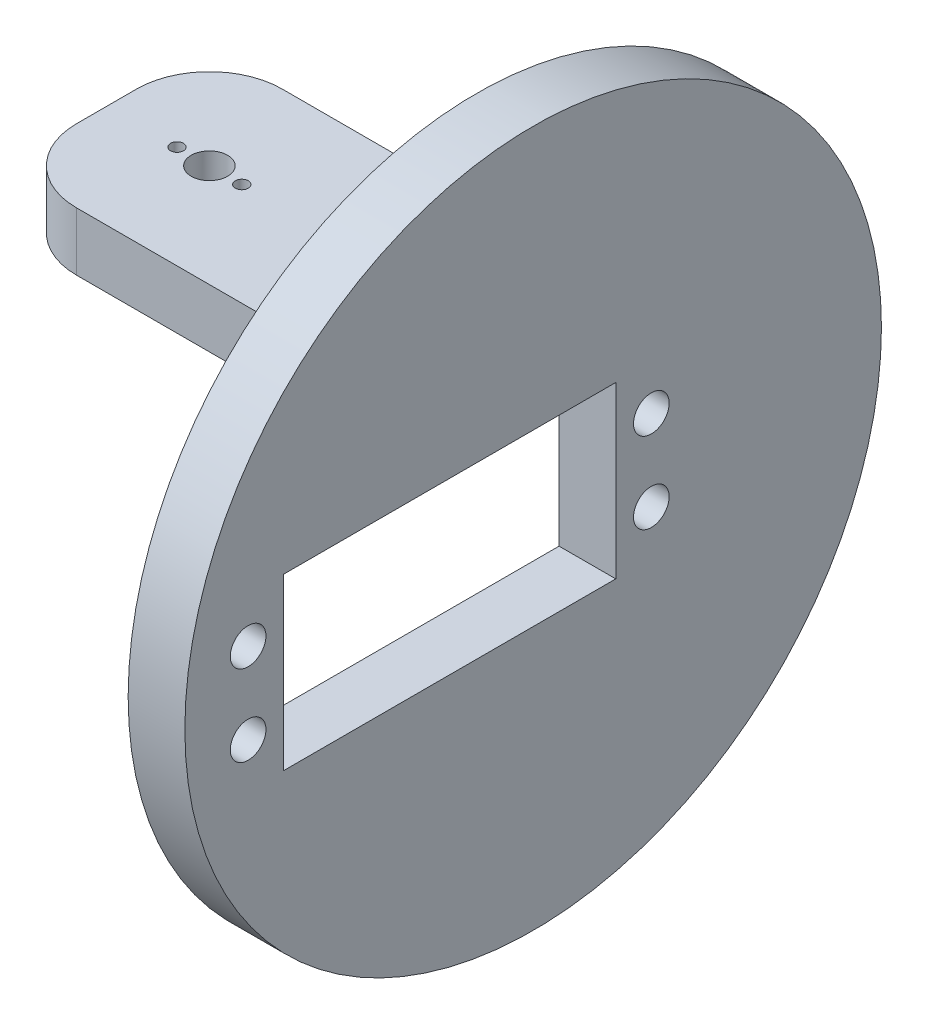
ISO-10303-21;
HEADER;
FILE_DESCRIPTION(('STEP AP214'),'2;1');
FILE_NAME('part.step','',(''),(''),'','','');
FILE_SCHEMA(('AUTOMOTIVE_DESIGN { 1 0 10303 214 1 1 1 1 }'));
ENDSEC;
DATA;
#1=APPLICATION_CONTEXT('core data for automotive mechanical design processes');
#2=APPLICATION_PROTOCOL_DEFINITION('international standard','automotive_design',2000,#1);
#3=PRODUCT_CONTEXT('',#1,'mechanical');
#4=PRODUCT('Part','Part','',(#3));
#5=PRODUCT_RELATED_PRODUCT_CATEGORY('part','',(#4));
#6=PRODUCT_DEFINITION_FORMATION('','',#4);
#7=PRODUCT_DEFINITION_CONTEXT('part definition',#1,'design');
#8=PRODUCT_DEFINITION('design','',#6,#7);
#9=PRODUCT_DEFINITION_SHAPE('','',#8);
#10=(LENGTH_UNIT() NAMED_UNIT(*) SI_UNIT(.MILLI.,.METRE.));
#11=(NAMED_UNIT(*) PLANE_ANGLE_UNIT() SI_UNIT($,.RADIAN.));
#12=(NAMED_UNIT(*) SI_UNIT($,.STERADIAN.) SOLID_ANGLE_UNIT());
#13=UNCERTAINTY_MEASURE_WITH_UNIT(LENGTH_MEASURE(1.E-05),#10,'distance_accuracy_value','');
#14=(GEOMETRIC_REPRESENTATION_CONTEXT(3) GLOBAL_UNCERTAINTY_ASSIGNED_CONTEXT((#13)) GLOBAL_UNIT_ASSIGNED_CONTEXT((#10,
#11,#12)) REPRESENTATION_CONTEXT('',''));
#15=CARTESIAN_POINT('',(0.,0.,0.));
#16=DIRECTION('',(0.,0.,1.));
#17=DIRECTION('',(1.,0.,0.));
#18=AXIS2_PLACEMENT_3D('',#15,#16,#17);
#19=CARTESIAN_POINT('',(-15.1051071083568,0.,0.66801642900486));
#20=DIRECTION('',(0.,1.,0.));
#21=DIRECTION('',(0.,0.,1.));
#22=AXIS2_PLACEMENT_3D('',#19,#20,#21);
#23=CYLINDRICAL_SURFACE('',#22,2.25);
#24=CARTESIAN_POINT('',(-15.1051071083568,7.2,0.66801642900486));
#25=DIRECTION('',(0.,1.,0.));
#26=DIRECTION('',(0.,0.,1.));
#27=AXIS2_PLACEMENT_3D('',#24,#25,#26);
#28=CIRCLE('',#27,2.25);
#29=CARTESIAN_POINT('',(-15.1051071083568,7.2,2.91801642900486));
#30=VERTEX_POINT('',#29);
#31=EDGE_CURVE('E239',#30,#30,#28,.T.);
#32=ORIENTED_EDGE('',*,*,#31,.T.);
#33=EDGE_LOOP('',(#32));
#34=FACE_BOUND('',#33,.T.);
#35=CARTESIAN_POINT('',(-15.1051071083568,4.,0.66801642900486));
#36=DIRECTION('',(0.,-1.,0.));
#37=DIRECTION('',(0.,0.,-1.));
#38=AXIS2_PLACEMENT_3D('',#35,#36,#37);
#39=CIRCLE('',#38,2.25);
#40=CARTESIAN_POINT('',(-15.1051071083568,4.,-1.58198357099514));
#41=VERTEX_POINT('',#40);
#42=EDGE_CURVE('E232',#41,#41,#39,.F.);
#43=ORIENTED_EDGE('',*,*,#42,.F.);
#44=EDGE_LOOP('',(#43));
#45=FACE_BOUND('',#44,.T.);
#46=ADVANCED_FACE('F32',(#34,#45),#23,.F.);
#47=CARTESIAN_POINT('',(-19.1051071083568,0.,0.66801642900486));
#48=DIRECTION('',(0.,1.,0.));
#49=DIRECTION('',(0.,0.,1.));
#50=AXIS2_PLACEMENT_3D('',#47,#48,#49);
#51=CYLINDRICAL_SURFACE('',#50,0.799999999999999);
#52=CARTESIAN_POINT('',(-19.1051071083568,7.2,0.66801642900486));
#53=DIRECTION('',(0.,1.,0.));
#54=DIRECTION('',(0.,0.,1.));
#55=AXIS2_PLACEMENT_3D('',#52,#53,#54);
#56=CIRCLE('',#55,0.799999999999999);
#57=CARTESIAN_POINT('',(-19.1051071083568,7.2,1.46801642900486));
#58=VERTEX_POINT('',#57);
#59=EDGE_CURVE('E236',#58,#58,#56,.T.);
#60=ORIENTED_EDGE('',*,*,#59,.T.);
#61=EDGE_LOOP('',(#60));
#62=FACE_BOUND('',#61,.T.);
#63=CARTESIAN_POINT('',(-19.1051071083568,4.,0.66801642900486));
#64=DIRECTION('',(0.,-1.,0.));
#65=DIRECTION('',(0.,0.,-1.));
#66=AXIS2_PLACEMENT_3D('',#63,#64,#65);
#67=CIRCLE('',#66,0.799999999999999);
#68=CARTESIAN_POINT('',(-19.1051071083568,4.,-0.131983570995139));
#69=VERTEX_POINT('',#68);
#70=EDGE_CURVE('E229',#69,#69,#67,.F.);
#71=ORIENTED_EDGE('',*,*,#70,.F.);
#72=EDGE_LOOP('',(#71));
#73=FACE_BOUND('',#72,.T.);
#74=ADVANCED_FACE('F335',(#62,#73),#51,.F.);
#75=CARTESIAN_POINT('',(-11.1051071083568,0.,0.66801642900486));
#76=DIRECTION('',(0.,1.,0.));
#77=DIRECTION('',(0.,0.,1.));
#78=AXIS2_PLACEMENT_3D('',#75,#76,#77);
#79=CYLINDRICAL_SURFACE('',#78,0.800000000000001);
#80=CARTESIAN_POINT('',(-11.1051071083568,7.2,0.66801642900486));
#81=DIRECTION('',(0.,1.,0.));
#82=DIRECTION('',(0.,0.,1.));
#83=AXIS2_PLACEMENT_3D('',#80,#81,#82);
#84=CIRCLE('',#83,0.800000000000001);
#85=CARTESIAN_POINT('',(-11.1051071083568,7.2,1.46801642900486));
#86=VERTEX_POINT('',#85);
#87=EDGE_CURVE('E235',#86,#86,#84,.T.);
#88=ORIENTED_EDGE('',*,*,#87,.T.);
#89=EDGE_LOOP('',(#88));
#90=FACE_BOUND('',#89,.T.);
#91=CARTESIAN_POINT('',(-11.1051071083568,4.,0.66801642900486));
#92=DIRECTION('',(0.,-1.,0.));
#93=DIRECTION('',(0.,0.,-1.));
#94=AXIS2_PLACEMENT_3D('',#91,#92,#93);
#95=CIRCLE('',#94,0.800000000000001);
#96=CARTESIAN_POINT('',(-11.1051071083568,4.,-0.131983570995141));
#97=VERTEX_POINT('',#96);
#98=EDGE_CURVE('E36',#97,#97,#95,.F.);
#99=ORIENTED_EDGE('',*,*,#98,.F.);
#100=EDGE_LOOP('',(#99));
#101=FACE_BOUND('',#100,.T.);
#102=ADVANCED_FACE('F341',(#90,#101),#79,.F.);
#103=CARTESIAN_POINT('',(-27.8051071083568,7.2,-12.0319835709951));
#104=DIRECTION('',(1.,0.,0.));
#105=DIRECTION('',(0.,0.,-1.));
#106=AXIS2_PLACEMENT_3D('',#103,#104,#105);
#107=PLANE('',#106);
#108=DIRECTION('',(0.,0.,1.));
#109=VECTOR('',#108,1.);
#110=CARTESIAN_POINT('',(-27.8051071083568,0.,-12.0319835709951));
#111=LINE('',#110,#109);
#112=CARTESIAN_POINT('',(-27.8051071083568,0.,-3.03198357099514));
#113=VERTEX_POINT('',#112);
#114=CARTESIAN_POINT('',(-27.8051071083568,0.,4.36801642900486));
#115=VERTEX_POINT('',#114);
#116=EDGE_CURVE('E244',#113,#115,#111,.T.);
#117=ORIENTED_EDGE('',*,*,#116,.T.);
#118=DIRECTION('',(0.,-1.,0.));
#119=VECTOR('',#118,1.);
#120=CARTESIAN_POINT('',(-27.8051071083568,7.2,4.36801642900486));
#121=LINE('',#120,#119);
#122=CARTESIAN_POINT('',(-27.8051071083568,7.2,4.36801642900486));
#123=VERTEX_POINT('',#122);
#124=EDGE_CURVE('E281',#115,#123,#121,.F.);
#125=ORIENTED_EDGE('',*,*,#124,.T.);
#126=DIRECTION('',(0.,0.,1.));
#127=VECTOR('',#126,1.);
#128=CARTESIAN_POINT('',(-27.8051071083568,7.2,-12.0319835709951));
#129=LINE('',#128,#127);
#130=CARTESIAN_POINT('',(-27.8051071083568,7.2,-3.03198357099514));
#131=VERTEX_POINT('',#130);
#132=EDGE_CURVE('E245',#131,#123,#129,.T.);
#133=ORIENTED_EDGE('',*,*,#132,.F.);
#134=DIRECTION('',(0.,-1.,0.));
#135=VECTOR('',#134,1.);
#136=CARTESIAN_POINT('',(-27.8051071083568,7.2,-3.03198357099514));
#137=LINE('',#136,#135);
#138=EDGE_CURVE('E278',#131,#113,#137,.T.);
#139=ORIENTED_EDGE('',*,*,#138,.T.);
#140=EDGE_LOOP('',(#117,#125,#133,#139));
#141=FACE_BOUND('',#140,.T.);
#142=ADVANCED_FACE('F303',(#141),#107,.F.);
#143=CARTESIAN_POINT('',(-27.8051071083568,7.2,13.3680164290049));
#144=DIRECTION('',(0.,0.,-1.));
#145=DIRECTION('',(-1.,0.,0.));
#146=AXIS2_PLACEMENT_3D('',#143,#144,#145);
#147=PLANE('',#146);
#148=DIRECTION('',(1.,0.,0.));
#149=VECTOR('',#148,1.);
#150=CARTESIAN_POINT('',(-27.8051071083568,7.2,13.3680164290049));
#151=LINE('',#150,#149);
#152=CARTESIAN_POINT('',(-18.8051071083568,7.2,13.3680164290049));
#153=VERTEX_POINT('',#152);
#154=CARTESIAN_POINT('',(17.1948928916432,7.2,13.3680164290049));
#155=VERTEX_POINT('',#154);
#156=EDGE_CURVE('E248',#153,#155,#151,.T.);
#157=ORIENTED_EDGE('',*,*,#156,.F.);
#158=DIRECTION('',(0.,-1.,0.));
#159=VECTOR('',#158,1.);
#160=CARTESIAN_POINT('',(-18.8051071083568,7.2,13.3680164290049));
#161=LINE('',#160,#159);
#162=CARTESIAN_POINT('',(-18.8051071083568,0.,13.3680164290049));
#163=VERTEX_POINT('',#162);
#164=EDGE_CURVE('E271',#153,#163,#161,.T.);
#165=ORIENTED_EDGE('',*,*,#164,.T.);
#166=DIRECTION('',(1.,0.,0.));
#167=VECTOR('',#166,1.);
#168=CARTESIAN_POINT('',(-27.8051071083568,0.,13.3680164290049));
#169=LINE('',#168,#167);
#170=CARTESIAN_POINT('',(17.1948928916432,0.,13.3680164290049));
#171=VERTEX_POINT('',#170);
#172=EDGE_CURVE('E259',#163,#171,#169,.T.);
#173=ORIENTED_EDGE('',*,*,#172,.T.);
#174=DIRECTION('',(0.,-1.,0.));
#175=VECTOR('',#174,1.);
#176=CARTESIAN_POINT('',(17.1948928916432,7.2,13.3680164290049));
#177=LINE('',#176,#175);
#178=EDGE_CURVE('E268',#155,#171,#177,.T.);
#179=ORIENTED_EDGE('',*,*,#178,.F.);
#180=EDGE_LOOP('',(#157,#165,#173,#179));
#181=FACE_BOUND('',#180,.T.);
#182=ADVANCED_FACE('F295',(#181),#147,.F.);
#183=CARTESIAN_POINT('',(-27.8051071083568,7.2,-12.0319835709951));
#184=DIRECTION('',(0.,0.,1.));
#185=DIRECTION('',(1.,0.,0.));
#186=AXIS2_PLACEMENT_3D('',#183,#184,#185);
#187=PLANE('',#186);
#188=DIRECTION('',(-1.,0.,0.));
#189=VECTOR('',#188,1.);
#190=CARTESIAN_POINT('',(-27.8051071083568,0.,-12.0319835709951));
#191=LINE('',#190,#189);
#192=CARTESIAN_POINT('',(17.1948928916432,0.,-12.0319835709951));
#193=VERTEX_POINT('',#192);
#194=CARTESIAN_POINT('',(-18.8051071083568,0.,-12.0319835709951));
#195=VERTEX_POINT('',#194);
#196=EDGE_CURVE('E249',#193,#195,#191,.T.);
#197=ORIENTED_EDGE('',*,*,#196,.T.);
#198=DIRECTION('',(0.,-1.,0.));
#199=VECTOR('',#198,1.);
#200=CARTESIAN_POINT('',(-18.8051071083568,7.2,-12.0319835709951));
#201=LINE('',#200,#199);
#202=CARTESIAN_POINT('',(-18.8051071083568,7.2,-12.0319835709951));
#203=VERTEX_POINT('',#202);
#204=EDGE_CURVE('E11',#195,#203,#201,.F.);
#205=ORIENTED_EDGE('',*,*,#204,.T.);
#206=DIRECTION('',(-1.,0.,0.));
#207=VECTOR('',#206,1.);
#208=CARTESIAN_POINT('',(-27.8051071083568,7.2,-12.0319835709951));
#209=LINE('',#208,#207);
#210=CARTESIAN_POINT('',(17.1948928916432,7.2,-12.0319835709951));
#211=VERTEX_POINT('',#210);
#212=EDGE_CURVE('E253',#211,#203,#209,.T.);
#213=ORIENTED_EDGE('',*,*,#212,.F.);
#214=DIRECTION('',(0.,-1.,0.));
#215=VECTOR('',#214,1.);
#216=CARTESIAN_POINT('',(17.1948928916432,7.2,-12.0319835709951));
#217=LINE('',#216,#215);
#218=EDGE_CURVE('E256',#211,#193,#217,.T.);
#219=ORIENTED_EDGE('',*,*,#218,.T.);
#220=EDGE_LOOP('',(#197,#205,#213,#219));
#221=FACE_BOUND('',#220,.T.);
#222=ADVANCED_FACE('F310',(#221),#187,.F.);
#223=CARTESIAN_POINT('',(0.,7.2,0.));
#224=DIRECTION('',(0.,1.,0.));
#225=DIRECTION('',(0.,0.,1.));
#226=AXIS2_PLACEMENT_3D('',#223,#224,#225);
#227=PLANE('',#226);
#228=ORIENTED_EDGE('',*,*,#87,.F.);
#229=EDGE_LOOP('',(#228));
#230=FACE_BOUND('',#229,.T.);
#231=ORIENTED_EDGE('',*,*,#59,.F.);
#232=EDGE_LOOP('',(#231));
#233=FACE_BOUND('',#232,.T.);
#234=ORIENTED_EDGE('',*,*,#31,.F.);
#235=EDGE_LOOP('',(#234));
#236=FACE_BOUND('',#235,.T.);
#237=ORIENTED_EDGE('',*,*,#132,.T.);
#238=CARTESIAN_POINT('',(-18.8051071083568,7.2,4.36801642900486));
#239=DIRECTION('',(0.,1.,0.));
#240=DIRECTION('',(0.,0.,1.));
#241=AXIS2_PLACEMENT_3D('',#238,#239,#240);
#242=CIRCLE('',#241,9.);
#243=EDGE_CURVE('E41',#123,#153,#242,.T.);
#244=ORIENTED_EDGE('',*,*,#243,.T.);
#245=ORIENTED_EDGE('',*,*,#156,.T.);
#246=DIRECTION('',(0.,0.,-1.));
#247=VECTOR('',#246,1.);
#248=CARTESIAN_POINT('',(17.1948928916432,7.2,-12.0319835709951));
#249=LINE('',#248,#247);
#250=EDGE_CURVE('E251',#155,#211,#249,.T.);
#251=ORIENTED_EDGE('',*,*,#250,.T.);
#252=ORIENTED_EDGE('',*,*,#212,.T.);
#253=CARTESIAN_POINT('',(-18.8051071083568,7.2,-3.03198357099514));
#254=DIRECTION('',(0.,1.,0.));
#255=DIRECTION('',(0.,0.,1.));
#256=AXIS2_PLACEMENT_3D('',#253,#254,#255);
#257=CIRCLE('',#256,9.);
#258=EDGE_CURVE('E283',#203,#131,#257,.T.);
#259=ORIENTED_EDGE('',*,*,#258,.T.);
#260=EDGE_LOOP('',(#237,#244,#245,#251,#252,#259));
#261=FACE_BOUND('',#260,.T.);
#262=ADVANCED_FACE('F288',(#230,#233,#236,#261),#227,.T.);
#263=CARTESIAN_POINT('',(0.,0.,0.));
#264=DIRECTION('',(0.,1.,0.));
#265=DIRECTION('',(0.,0.,1.));
#266=AXIS2_PLACEMENT_3D('',#263,#264,#265);
#267=PLANE('',#266);
#268=DIRECTION('',(1.,0.,0.));
#269=VECTOR('',#268,1.);
#270=CARTESIAN_POINT('',(-19.1051071083568,0.,-2.4822661461066));
#271=LINE('',#270,#269);
#272=CARTESIAN_POINT('',(-19.1051071083568,0.,-2.4822661461066));
#273=VERTEX_POINT('',#272);
#274=CARTESIAN_POINT('',(-11.1051071083567,0.,-2.4822661461066));
#275=VERTEX_POINT('',#274);
#276=EDGE_CURVE('E213',#273,#275,#271,.T.);
#277=ORIENTED_EDGE('',*,*,#276,.F.);
#278=CARTESIAN_POINT('',(-19.1051071083568,0.,0.66801642900486));
#279=DIRECTION('',(0.,-1.,0.));
#280=DIRECTION('',(0.,0.,-1.));
#281=AXIS2_PLACEMENT_3D('',#278,#279,#280);
#282=CIRCLE('',#281,3.15028257511146);
#283=CARTESIAN_POINT('',(-19.1051071083568,0.,3.81829900411632));
#284=VERTEX_POINT('',#283);
#285=EDGE_CURVE('E195',#284,#273,#282,.T.);
#286=ORIENTED_EDGE('',*,*,#285,.F.);
#287=DIRECTION('',(-1.,0.,0.));
#288=VECTOR('',#287,1.);
#289=CARTESIAN_POINT('',(-19.1051071083568,0.,3.81829900411632));
#290=LINE('',#289,#288);
#291=CARTESIAN_POINT('',(-11.1051071083567,0.,3.81829900411632));
#292=VERTEX_POINT('',#291);
#293=EDGE_CURVE('E202',#292,#284,#290,.T.);
#294=ORIENTED_EDGE('',*,*,#293,.F.);
#295=CARTESIAN_POINT('',(-11.1051071083567,0.,0.66801642900486));
#296=DIRECTION('',(0.,-1.,0.));
#297=DIRECTION('',(0.,0.,-1.));
#298=AXIS2_PLACEMENT_3D('',#295,#296,#297);
#299=CIRCLE('',#298,3.15028257511146);
#300=EDGE_CURVE('E216',#275,#292,#299,.T.);
#301=ORIENTED_EDGE('',*,*,#300,.F.);
#302=EDGE_LOOP('',(#277,#286,#294,#301));
#303=FACE_BOUND('',#302,.T.);
#304=ORIENTED_EDGE('',*,*,#172,.F.);
#305=CARTESIAN_POINT('',(-18.8051071083568,0.,4.36801642900486));
#306=DIRECTION('',(0.,1.,0.));
#307=DIRECTION('',(0.,0.,1.));
#308=AXIS2_PLACEMENT_3D('',#305,#306,#307);
#309=CIRCLE('',#308,9.);
#310=EDGE_CURVE('E276',#163,#115,#309,.F.);
#311=ORIENTED_EDGE('',*,*,#310,.T.);
#312=ORIENTED_EDGE('',*,*,#116,.F.);
#313=CARTESIAN_POINT('',(-18.8051071083568,0.,-3.03198357099514));
#314=DIRECTION('',(0.,1.,0.));
#315=DIRECTION('',(0.,0.,1.));
#316=AXIS2_PLACEMENT_3D('',#313,#314,#315);
#317=CIRCLE('',#316,9.);
#318=EDGE_CURVE('E274',#113,#195,#317,.F.);
#319=ORIENTED_EDGE('',*,*,#318,.T.);
#320=ORIENTED_EDGE('',*,*,#196,.F.);
#321=DIRECTION('',(0.,0.,-1.));
#322=VECTOR('',#321,1.);
#323=CARTESIAN_POINT('',(17.1948928916432,0.,-12.0319835709951));
#324=LINE('',#323,#322);
#325=EDGE_CURVE('E262',#171,#193,#324,.T.);
#326=ORIENTED_EDGE('',*,*,#325,.F.);
#327=EDGE_LOOP('',(#304,#311,#312,#319,#320,#326));
#328=FACE_BOUND('',#327,.T.);
#329=ADVANCED_FACE('F301',(#303,#328),#267,.F.);
#330=CARTESIAN_POINT('',(-18.8051071083568,7.2,4.36801642900486));
#331=DIRECTION('',(0.,-1.,0.));
#332=DIRECTION('',(0.,0.,-1.));
#333=AXIS2_PLACEMENT_3D('',#330,#331,#332);
#334=CYLINDRICAL_SURFACE('',#333,9.);
#335=ORIENTED_EDGE('',*,*,#243,.F.);
#336=ORIENTED_EDGE('',*,*,#124,.F.);
#337=ORIENTED_EDGE('',*,*,#310,.F.);
#338=ORIENTED_EDGE('',*,*,#164,.F.);
#339=EDGE_LOOP('',(#335,#336,#337,#338));
#340=FACE_BOUND('',#339,.T.);
#341=ADVANCED_FACE('F298',(#340),#334,.T.);
#342=CARTESIAN_POINT('',(-18.8051071083568,7.2,-3.03198357099514));
#343=DIRECTION('',(0.,-1.,0.));
#344=DIRECTION('',(0.,0.,-1.));
#345=AXIS2_PLACEMENT_3D('',#342,#343,#344);
#346=CYLINDRICAL_SURFACE('',#345,9.);
#347=ORIENTED_EDGE('',*,*,#258,.F.);
#348=ORIENTED_EDGE('',*,*,#204,.F.);
#349=ORIENTED_EDGE('',*,*,#318,.F.);
#350=ORIENTED_EDGE('',*,*,#138,.F.);
#351=EDGE_LOOP('',(#347,#348,#349,#350));
#352=FACE_BOUND('',#351,.T.);
#353=ADVANCED_FACE('F34',(#352),#346,.T.);
#354=CARTESIAN_POINT('',(-19.1051071083568,4.,0.66801642900486));
#355=DIRECTION('',(0.,-1.,0.));
#356=DIRECTION('',(0.,0.,-1.));
#357=AXIS2_PLACEMENT_3D('',#354,#355,#356);
#358=PLANE('',#357);
#359=CARTESIAN_POINT('',(-19.1051071083568,4.,0.66801642900486));
#360=DIRECTION('',(0.,-1.,0.));
#361=DIRECTION('',(0.,0.,-1.));
#362=AXIS2_PLACEMENT_3D('',#359,#360,#361);
#363=CIRCLE('',#362,3.15028257511146);
#364=CARTESIAN_POINT('',(-19.1051071083568,4.,3.81829900411632));
#365=VERTEX_POINT('',#364);
#366=CARTESIAN_POINT('',(-19.1051071083568,4.,-2.4822661461066));
#367=VERTEX_POINT('',#366);
#368=EDGE_CURVE('E198',#365,#367,#363,.T.);
#369=ORIENTED_EDGE('',*,*,#368,.T.);
#370=DIRECTION('',(1.,0.,0.));
#371=VECTOR('',#370,1.);
#372=CARTESIAN_POINT('',(-19.1051071083568,4.,-2.4822661461066));
#373=LINE('',#372,#371);
#374=CARTESIAN_POINT('',(-11.1051071083567,4.,-2.4822661461066));
#375=VERTEX_POINT('',#374);
#376=EDGE_CURVE('E201',#367,#375,#373,.T.);
#377=ORIENTED_EDGE('',*,*,#376,.T.);
#378=CARTESIAN_POINT('',(-11.1051071083567,4.,0.66801642900486));
#379=DIRECTION('',(0.,-1.,0.));
#380=DIRECTION('',(0.,0.,-1.));
#381=AXIS2_PLACEMENT_3D('',#378,#379,#380);
#382=CIRCLE('',#381,3.15028257511146);
#383=CARTESIAN_POINT('',(-11.1051071083567,4.,3.81829900411632));
#384=VERTEX_POINT('',#383);
#385=EDGE_CURVE('E205',#375,#384,#382,.T.);
#386=ORIENTED_EDGE('',*,*,#385,.T.);
#387=DIRECTION('',(-1.,0.,0.));
#388=VECTOR('',#387,1.);
#389=CARTESIAN_POINT('',(-19.1051071083568,4.,3.81829900411632));
#390=LINE('',#389,#388);
#391=EDGE_CURVE('E208',#384,#365,#390,.T.);
#392=ORIENTED_EDGE('',*,*,#391,.T.);
#393=EDGE_LOOP('',(#369,#377,#386,#392));
#394=FACE_BOUND('',#393,.T.);
#395=ORIENTED_EDGE('',*,*,#98,.T.);
#396=EDGE_LOOP('',(#395));
#397=FACE_BOUND('',#396,.T.);
#398=ORIENTED_EDGE('',*,*,#70,.T.);
#399=EDGE_LOOP('',(#398));
#400=FACE_BOUND('',#399,.T.);
#401=ORIENTED_EDGE('',*,*,#42,.T.);
#402=EDGE_LOOP('',(#401));
#403=FACE_BOUND('',#402,.T.);
#404=ADVANCED_FACE('F362',(#394,#397,#400,#403),#358,.T.);
#405=CARTESIAN_POINT('',(-19.1051071083568,4.,0.66801642900486));
#406=DIRECTION('',(0.,-1.,0.));
#407=DIRECTION('',(0.,0.,-1.));
#408=AXIS2_PLACEMENT_3D('',#405,#406,#407);
#409=CYLINDRICAL_SURFACE('',#408,3.15028257511146);
#410=ORIENTED_EDGE('',*,*,#285,.T.);
#411=DIRECTION('',(0.,-1.,0.));
#412=VECTOR('',#411,1.);
#413=CARTESIAN_POINT('',(-19.1051071083568,4.,-2.4822661461066));
#414=LINE('',#413,#412);
#415=EDGE_CURVE('E211',#367,#273,#414,.T.);
#416=ORIENTED_EDGE('',*,*,#415,.F.);
#417=ORIENTED_EDGE('',*,*,#368,.F.);
#418=DIRECTION('',(0.,-1.,0.));
#419=VECTOR('',#418,1.);
#420=CARTESIAN_POINT('',(-19.1051071083568,4.,3.81829900411632));
#421=LINE('',#420,#419);
#422=EDGE_CURVE('E221',#365,#284,#421,.T.);
#423=ORIENTED_EDGE('',*,*,#422,.T.);
#424=EDGE_LOOP('',(#410,#416,#417,#423));
#425=FACE_BOUND('',#424,.T.);
#426=ADVANCED_FACE('F366',(#425),#409,.F.);
#427=CARTESIAN_POINT('',(-19.1051071083568,4.,3.81829900411632));
#428=DIRECTION('',(0.,0.,1.));
#429=DIRECTION('',(1.,0.,0.));
#430=AXIS2_PLACEMENT_3D('',#427,#428,#429);
#431=PLANE('',#430);
#432=ORIENTED_EDGE('',*,*,#293,.T.);
#433=ORIENTED_EDGE('',*,*,#422,.F.);
#434=ORIENTED_EDGE('',*,*,#391,.F.);
#435=DIRECTION('',(0.,-1.,0.));
#436=VECTOR('',#435,1.);
#437=CARTESIAN_POINT('',(-11.1051071083567,4.,3.81829900411632));
#438=LINE('',#437,#436);
#439=EDGE_CURVE('E223',#384,#292,#438,.T.);
#440=ORIENTED_EDGE('',*,*,#439,.T.);
#441=EDGE_LOOP('',(#432,#433,#434,#440));
#442=FACE_BOUND('',#441,.T.);
#443=ADVANCED_FACE('F372',(#442),#431,.F.);
#444=CARTESIAN_POINT('',(-11.1051071083567,4.,0.66801642900486));
#445=DIRECTION('',(0.,-1.,0.));
#446=DIRECTION('',(0.,0.,-1.));
#447=AXIS2_PLACEMENT_3D('',#444,#445,#446);
#448=CYLINDRICAL_SURFACE('',#447,3.15028257511146);
#449=ORIENTED_EDGE('',*,*,#300,.T.);
#450=ORIENTED_EDGE('',*,*,#439,.F.);
#451=ORIENTED_EDGE('',*,*,#385,.F.);
#452=DIRECTION('',(0.,-1.,0.));
#453=VECTOR('',#452,1.);
#454=CARTESIAN_POINT('',(-11.1051071083567,4.,-2.4822661461066));
#455=LINE('',#454,#453);
#456=EDGE_CURVE('E225',#375,#275,#455,.T.);
#457=ORIENTED_EDGE('',*,*,#456,.T.);
#458=EDGE_LOOP('',(#449,#450,#451,#457));
#459=FACE_BOUND('',#458,.T.);
#460=ADVANCED_FACE('F328',(#459),#448,.F.);
#461=CARTESIAN_POINT('',(-19.1051071083568,4.,-2.4822661461066));
#462=DIRECTION('',(0.,0.,-1.));
#463=DIRECTION('',(-1.,0.,0.));
#464=AXIS2_PLACEMENT_3D('',#461,#462,#463);
#465=PLANE('',#464);
#466=ORIENTED_EDGE('',*,*,#276,.T.);
#467=ORIENTED_EDGE('',*,*,#456,.F.);
#468=ORIENTED_EDGE('',*,*,#376,.F.);
#469=ORIENTED_EDGE('',*,*,#415,.T.);
#470=EDGE_LOOP('',(#466,#467,#468,#469));
#471=FACE_BOUND('',#470,.T.);
#472=ADVANCED_FACE('F317',(#471),#465,.F.);
#473=CARTESIAN_POINT('',(17.1948928916432,-12.2514479748668,0.));
#474=DIRECTION('',(1.,0.,0.));
#475=DIRECTION('',(0.,0.,-1.));
#476=AXIS2_PLACEMENT_3D('',#473,#474,#475);
#477=PLANE('',#476);
#478=CARTESIAN_POINT('',(17.1948928916432,-17.2514479748667,-14.5896133009768));
#479=DIRECTION('',(-1.,0.,0.));
#480=DIRECTION('',(0.,0.,1.));
#481=AXIS2_PLACEMENT_3D('',#478,#479,#480);
#482=CIRCLE('',#481,2.19999999999424);
#483=CARTESIAN_POINT('',(17.1948928916432,-17.2514479748667,-12.3896133009825));
#484=VERTEX_POINT('',#483);
#485=EDGE_CURVE('E180',#484,#484,#482,.T.);
#486=ORIENTED_EDGE('',*,*,#485,.F.);
#487=EDGE_LOOP('',(#486));
#488=FACE_BOUND('',#487,.T.);
#489=CARTESIAN_POINT('',(17.1948928916432,-7.25144797486675,-14.5896133009768));
#490=DIRECTION('',(-1.,0.,0.));
#491=DIRECTION('',(0.,0.,1.));
#492=AXIS2_PLACEMENT_3D('',#489,#490,#491);
#493=CIRCLE('',#492,2.1999999999906);
#494=CARTESIAN_POINT('',(17.1948928916432,-7.25144797486675,-12.3896133009862));
#495=VERTEX_POINT('',#494);
#496=EDGE_CURVE('E174',#495,#495,#493,.T.);
#497=ORIENTED_EDGE('',*,*,#496,.F.);
#498=EDGE_LOOP('',(#497));
#499=FACE_BOUND('',#498,.T.);
#500=CARTESIAN_POINT('',(17.1948928916432,-17.2514479748667,35.1896133009769));
#501=DIRECTION('',(-1.,0.,0.));
#502=DIRECTION('',(0.,0.,1.));
#503=AXIS2_PLACEMENT_3D('',#500,#501,#502);
#504=CIRCLE('',#503,2.19999999994979);
#505=CARTESIAN_POINT('',(17.1948928916432,-17.2514479748667,37.3896133009267));
#506=VERTEX_POINT('',#505);
#507=EDGE_CURVE('E168',#506,#506,#504,.T.);
#508=ORIENTED_EDGE('',*,*,#507,.F.);
#509=EDGE_LOOP('',(#508));
#510=FACE_BOUND('',#509,.T.);
#511=DIRECTION('',(0.,0.,1.));
#512=VECTOR('',#511,1.);
#513=CARTESIAN_POINT('',(17.1948928916432,-22.7514479748667,30.8000000000001));
#514=LINE('',#513,#512);
#515=CARTESIAN_POINT('',(17.1948928916432,-22.7514479748667,-10.1999999999999));
#516=VERTEX_POINT('',#515);
#517=CARTESIAN_POINT('',(17.1948928916432,-22.7514479748667,30.8000000000001));
#518=VERTEX_POINT('',#517);
#519=EDGE_CURVE('E152',#516,#518,#514,.T.);
#520=ORIENTED_EDGE('',*,*,#519,.F.);
#521=DIRECTION('',(0.,-1.,0.));
#522=VECTOR('',#521,1.);
#523=CARTESIAN_POINT('',(17.1948928916432,-22.7514479748667,-10.1999999999999));
#524=LINE('',#523,#522);
#525=CARTESIAN_POINT('',(17.1948928916432,-1.75144797486674,-10.1999999999999));
#526=VERTEX_POINT('',#525);
#527=EDGE_CURVE('E48',#526,#516,#524,.T.);
#528=ORIENTED_EDGE('',*,*,#527,.F.);
#529=DIRECTION('',(0.,0.,-1.));
#530=VECTOR('',#529,1.);
#531=CARTESIAN_POINT('',(17.1948928916432,-1.75144797486674,30.8000000000001));
#532=LINE('',#531,#530);
#533=CARTESIAN_POINT('',(17.1948928916432,-1.75144797486674,30.8000000000001));
#534=VERTEX_POINT('',#533);
#535=EDGE_CURVE('E145',#534,#526,#532,.T.);
#536=ORIENTED_EDGE('',*,*,#535,.F.);
#537=DIRECTION('',(0.,1.,0.));
#538=VECTOR('',#537,1.);
#539=CARTESIAN_POINT('',(17.1948928916432,-22.7514479748667,30.8000000000001));
#540=LINE('',#539,#538);
#541=EDGE_CURVE('E159',#518,#534,#540,.T.);
#542=ORIENTED_EDGE('',*,*,#541,.F.);
#543=EDGE_LOOP('',(#520,#528,#536,#542));
#544=FACE_BOUND('',#543,.T.);
#545=CARTESIAN_POINT('',(17.1948928916432,-7.25144797486674,35.1896133009769));
#546=DIRECTION('',(-1.,0.,0.));
#547=DIRECTION('',(0.,0.,1.));
#548=AXIS2_PLACEMENT_3D('',#545,#546,#547);
#549=CIRCLE('',#548,2.20000000013325);
#550=CARTESIAN_POINT('',(17.1948928916432,-7.25144797486674,37.3896133011101));
#551=VERTEX_POINT('',#550);
#552=EDGE_CURVE('E186',#551,#551,#549,.T.);
#553=ORIENTED_EDGE('',*,*,#552,.F.);
#554=EDGE_LOOP('',(#553));
#555=FACE_BOUND('',#554,.T.);
#556=CARTESIAN_POINT('',(17.1948928916432,-12.2514479748668,0.));
#557=DIRECTION('',(1.,0.,0.));
#558=DIRECTION('',(0.,0.,-1.));
#559=AXIS2_PLACEMENT_3D('',#556,#557,#558);
#560=CIRCLE('',#559,43.);
#561=CARTESIAN_POINT('',(17.1948928916432,-12.2514479748668,-43.));
#562=VERTEX_POINT('',#561);
#563=EDGE_CURVE('E189',#562,#562,#560,.T.);
#564=ORIENTED_EDGE('',*,*,#563,.F.);
#565=EDGE_LOOP('',(#564));
#566=FACE_BOUND('',#565,.T.);
#567=ORIENTED_EDGE('',*,*,#178,.T.);
#568=ORIENTED_EDGE('',*,*,#325,.T.);
#569=ORIENTED_EDGE('',*,*,#218,.F.);
#570=ORIENTED_EDGE('',*,*,#250,.F.);
#571=EDGE_LOOP('',(#567,#568,#569,#570));
#572=FACE_BOUND('',#571,.T.);
#573=ADVANCED_FACE('F314',(#488,#499,#510,#544,#555,#566,#572),#477,.F.);
#574=CARTESIAN_POINT('',(24.1948928916432,-12.2514479748668,0.));
#575=DIRECTION('',(-1.,0.,0.));
#576=DIRECTION('',(0.,0.,1.));
#577=AXIS2_PLACEMENT_3D('',#574,#575,#576);
#578=CYLINDRICAL_SURFACE('',#577,43.);
#579=CARTESIAN_POINT('',(24.1948928916432,-12.2514479748668,0.));
#580=DIRECTION('',(1.,0.,0.));
#581=DIRECTION('',(0.,0.,-1.));
#582=AXIS2_PLACEMENT_3D('',#579,#580,#581);
#583=CIRCLE('',#582,43.);
#584=CARTESIAN_POINT('',(24.1948928916432,-12.2514479748668,-43.));
#585=VERTEX_POINT('',#584);
#586=EDGE_CURVE('E192',#585,#585,#583,.T.);
#587=ORIENTED_EDGE('',*,*,#586,.F.);
#588=EDGE_LOOP('',(#587));
#589=FACE_BOUND('',#588,.T.);
#590=ORIENTED_EDGE('',*,*,#563,.T.);
#591=EDGE_LOOP('',(#590));
#592=FACE_BOUND('',#591,.T.);
#593=ADVANCED_FACE('F316',(#589,#592),#578,.T.);
#594=CARTESIAN_POINT('',(24.1948928916432,-12.2514479748668,0.));
#595=DIRECTION('',(1.,0.,0.));
#596=DIRECTION('',(0.,0.,-1.));
#597=AXIS2_PLACEMENT_3D('',#594,#595,#596);
#598=PLANE('',#597);
#599=CARTESIAN_POINT('',(24.1948928916432,-17.2514479748667,-14.5896133009768));
#600=DIRECTION('',(1.,0.,0.));
#601=DIRECTION('',(0.,0.,-1.));
#602=AXIS2_PLACEMENT_3D('',#599,#600,#601);
#603=CIRCLE('',#602,2.19999999999424);
#604=CARTESIAN_POINT('',(24.1948928916432,-17.2514479748667,-16.789613300971));
#605=VERTEX_POINT('',#604);
#606=EDGE_CURVE('E183',#605,#605,#603,.F.);
#607=ORIENTED_EDGE('',*,*,#606,.T.);
#608=EDGE_LOOP('',(#607));
#609=FACE_BOUND('',#608,.T.);
#610=CARTESIAN_POINT('',(24.1948928916432,-7.25144797486675,-14.5896133009768));
#611=DIRECTION('',(1.,0.,0.));
#612=DIRECTION('',(0.,0.,-1.));
#613=AXIS2_PLACEMENT_3D('',#610,#611,#612);
#614=CIRCLE('',#613,2.1999999999906);
#615=CARTESIAN_POINT('',(24.1948928916432,-7.25144797486675,-16.7896133009674));
#616=VERTEX_POINT('',#615);
#617=EDGE_CURVE('E177',#616,#616,#614,.F.);
#618=ORIENTED_EDGE('',*,*,#617,.T.);
#619=EDGE_LOOP('',(#618));
#620=FACE_BOUND('',#619,.T.);
#621=CARTESIAN_POINT('',(24.1948928916432,-17.2514479748667,35.1896133009769));
#622=DIRECTION('',(1.,0.,0.));
#623=DIRECTION('',(0.,0.,-1.));
#624=AXIS2_PLACEMENT_3D('',#621,#622,#623);
#625=CIRCLE('',#624,2.19999999994979);
#626=CARTESIAN_POINT('',(24.1948928916432,-17.2514479748667,32.9896133010271));
#627=VERTEX_POINT('',#626);
#628=EDGE_CURVE('E171',#627,#627,#625,.F.);
#629=ORIENTED_EDGE('',*,*,#628,.T.);
#630=EDGE_LOOP('',(#629));
#631=FACE_BOUND('',#630,.T.);
#632=DIRECTION('',(0.,-1.,0.));
#633=VECTOR('',#632,1.);
#634=CARTESIAN_POINT('',(24.1948928916432,-22.7514479748667,-10.1999999999999));
#635=LINE('',#634,#633);
#636=CARTESIAN_POINT('',(24.1948928916432,-1.75144797486674,-10.1999999999999));
#637=VERTEX_POINT('',#636);
#638=CARTESIAN_POINT('',(24.1948928916432,-22.7514479748667,-10.1999999999999));
#639=VERTEX_POINT('',#638);
#640=EDGE_CURVE('E143',#637,#639,#635,.T.);
#641=ORIENTED_EDGE('',*,*,#640,.T.);
#642=DIRECTION('',(0.,0.,1.));
#643=VECTOR('',#642,1.);
#644=CARTESIAN_POINT('',(24.1948928916432,-22.7514479748667,30.8000000000001));
#645=LINE('',#644,#643);
#646=CARTESIAN_POINT('',(24.1948928916432,-22.7514479748667,30.8000000000001));
#647=VERTEX_POINT('',#646);
#648=EDGE_CURVE('E132',#639,#647,#645,.T.);
#649=ORIENTED_EDGE('',*,*,#648,.T.);
#650=DIRECTION('',(0.,1.,0.));
#651=VECTOR('',#650,1.);
#652=CARTESIAN_POINT('',(24.1948928916432,-22.7514479748667,30.8000000000001));
#653=LINE('',#652,#651);
#654=CARTESIAN_POINT('',(24.1948928916432,-1.75144797486674,30.8000000000001));
#655=VERTEX_POINT('',#654);
#656=EDGE_CURVE('E154',#647,#655,#653,.T.);
#657=ORIENTED_EDGE('',*,*,#656,.T.);
#658=DIRECTION('',(0.,0.,-1.));
#659=VECTOR('',#658,1.);
#660=CARTESIAN_POINT('',(24.1948928916432,-1.75144797486674,30.8000000000001));
#661=LINE('',#660,#659);
#662=EDGE_CURVE('E150',#655,#637,#661,.T.);
#663=ORIENTED_EDGE('',*,*,#662,.T.);
#664=EDGE_LOOP('',(#641,#649,#657,#663));
#665=FACE_BOUND('',#664,.T.);
#666=CARTESIAN_POINT('',(24.1948928916432,-7.25144797486674,35.1896133009769));
#667=DIRECTION('',(1.,0.,0.));
#668=DIRECTION('',(0.,0.,-1.));
#669=AXIS2_PLACEMENT_3D('',#666,#667,#668);
#670=CIRCLE('',#669,2.20000000013325);
#671=CARTESIAN_POINT('',(24.1948928916432,-7.25144797486674,32.9896133008437));
#672=VERTEX_POINT('',#671);
#673=EDGE_CURVE('E139',#672,#672,#670,.F.);
#674=ORIENTED_EDGE('',*,*,#673,.T.);
#675=EDGE_LOOP('',(#674));
#676=FACE_BOUND('',#675,.T.);
#677=ORIENTED_EDGE('',*,*,#586,.T.);
#678=EDGE_LOOP('',(#677));
#679=FACE_BOUND('',#678,.T.);
#680=ADVANCED_FACE('F148',(#609,#620,#631,#665,#676,#679),#598,.T.);
#681=CARTESIAN_POINT('',(24.1958928916433,-7.25144797486674,35.1896133009769));
#682=DIRECTION('',(-1.,0.,0.));
#683=DIRECTION('',(0.,0.,1.));
#684=AXIS2_PLACEMENT_3D('',#681,#682,#683);
#685=CYLINDRICAL_SURFACE('',#684,2.20000000013325);
#686=ORIENTED_EDGE('',*,*,#673,.F.);
#687=EDGE_LOOP('',(#686));
#688=FACE_BOUND('',#687,.T.);
#689=ORIENTED_EDGE('',*,*,#552,.T.);
#690=EDGE_LOOP('',(#689));
#691=FACE_BOUND('',#690,.T.);
#692=ADVANCED_FACE('F413',(#688,#691),#685,.F.);
#693=CARTESIAN_POINT('',(24.1958928916433,-22.7514479748667,-10.1999999999999));
#694=DIRECTION('',(0.,0.,-1.));
#695=DIRECTION('',(-1.,0.,0.));
#696=AXIS2_PLACEMENT_3D('',#693,#694,#695);
#697=PLANE('',#696);
#698=DIRECTION('',(-1.,0.,0.));
#699=VECTOR('',#698,1.);
#700=CARTESIAN_POINT('',(24.1958928916433,-1.75144797486674,-10.1999999999999));
#701=LINE('',#700,#699);
#702=EDGE_CURVE('E140',#637,#526,#701,.T.);
#703=ORIENTED_EDGE('',*,*,#702,.T.);
#704=ORIENTED_EDGE('',*,*,#527,.T.);
#705=DIRECTION('',(-1.,0.,0.));
#706=VECTOR('',#705,1.);
#707=CARTESIAN_POINT('',(24.1958928916433,-22.7514479748667,-10.1999999999999));
#708=LINE('',#707,#706);
#709=EDGE_CURVE('E134',#639,#516,#708,.T.);
#710=ORIENTED_EDGE('',*,*,#709,.F.);
#711=ORIENTED_EDGE('',*,*,#640,.F.);
#712=EDGE_LOOP('',(#703,#704,#710,#711));
#713=FACE_BOUND('',#712,.T.);
#714=ADVANCED_FACE('F142',(#713),#697,.F.);
#715=CARTESIAN_POINT('',(24.1958928916433,-1.75144797486674,30.8000000000001));
#716=DIRECTION('',(0.,1.,0.));
#717=DIRECTION('',(0.,0.,1.));
#718=AXIS2_PLACEMENT_3D('',#715,#716,#717);
#719=PLANE('',#718);
#720=DIRECTION('',(-1.,0.,0.));
#721=VECTOR('',#720,1.);
#722=CARTESIAN_POINT('',(24.1958928916433,-1.75144797486674,30.8000000000001));
#723=LINE('',#722,#721);
#724=EDGE_CURVE('E165',#655,#534,#723,.T.);
#725=ORIENTED_EDGE('',*,*,#724,.T.);
#726=ORIENTED_EDGE('',*,*,#535,.T.);
#727=ORIENTED_EDGE('',*,*,#702,.F.);
#728=ORIENTED_EDGE('',*,*,#662,.F.);
#729=EDGE_LOOP('',(#725,#726,#727,#728));
#730=FACE_BOUND('',#729,.T.);
#731=ADVANCED_FACE('F428',(#730),#719,.F.);
#732=CARTESIAN_POINT('',(24.1958928916433,-22.7514479748667,30.8000000000001));
#733=DIRECTION('',(0.,0.,1.));
#734=DIRECTION('',(1.,0.,0.));
#735=AXIS2_PLACEMENT_3D('',#732,#733,#734);
#736=PLANE('',#735);
#737=DIRECTION('',(-1.,0.,0.));
#738=VECTOR('',#737,1.);
#739=CARTESIAN_POINT('',(24.1958928916433,-22.7514479748667,30.8000000000001));
#740=LINE('',#739,#738);
#741=EDGE_CURVE('E56',#647,#518,#740,.T.);
#742=ORIENTED_EDGE('',*,*,#741,.T.);
#743=ORIENTED_EDGE('',*,*,#541,.T.);
#744=ORIENTED_EDGE('',*,*,#724,.F.);
#745=ORIENTED_EDGE('',*,*,#656,.F.);
#746=EDGE_LOOP('',(#742,#743,#744,#745));
#747=FACE_BOUND('',#746,.T.);
#748=ADVANCED_FACE('F435',(#747),#736,.F.);
#749=CARTESIAN_POINT('',(24.1958928916433,-22.7514479748667,30.8000000000001));
#750=DIRECTION('',(0.,-1.,0.));
#751=DIRECTION('',(0.,0.,-1.));
#752=AXIS2_PLACEMENT_3D('',#749,#750,#751);
#753=PLANE('',#752);
#754=ORIENTED_EDGE('',*,*,#709,.T.);
#755=ORIENTED_EDGE('',*,*,#519,.T.);
#756=ORIENTED_EDGE('',*,*,#741,.F.);
#757=ORIENTED_EDGE('',*,*,#648,.F.);
#758=EDGE_LOOP('',(#754,#755,#756,#757));
#759=FACE_BOUND('',#758,.T.);
#760=ADVANCED_FACE('F133',(#759),#753,.F.);
#761=CARTESIAN_POINT('',(24.1958928916433,-17.2514479748667,35.1896133009769));
#762=DIRECTION('',(-1.,0.,0.));
#763=DIRECTION('',(0.,0.,1.));
#764=AXIS2_PLACEMENT_3D('',#761,#762,#763);
#765=CYLINDRICAL_SURFACE('',#764,2.19999999994979);
#766=ORIENTED_EDGE('',*,*,#628,.F.);
#767=EDGE_LOOP('',(#766));
#768=FACE_BOUND('',#767,.T.);
#769=ORIENTED_EDGE('',*,*,#507,.T.);
#770=EDGE_LOOP('',(#769));
#771=FACE_BOUND('',#770,.T.);
#772=ADVANCED_FACE('F450',(#768,#771),#765,.F.);
#773=CARTESIAN_POINT('',(24.1958928916433,-7.25144797486675,-14.5896133009768));
#774=DIRECTION('',(-1.,0.,0.));
#775=DIRECTION('',(0.,0.,1.));
#776=AXIS2_PLACEMENT_3D('',#773,#774,#775);
#777=CYLINDRICAL_SURFACE('',#776,2.1999999999906);
#778=ORIENTED_EDGE('',*,*,#617,.F.);
#779=EDGE_LOOP('',(#778));
#780=FACE_BOUND('',#779,.T.);
#781=ORIENTED_EDGE('',*,*,#496,.T.);
#782=EDGE_LOOP('',(#781));
#783=FACE_BOUND('',#782,.T.);
#784=ADVANCED_FACE('F457',(#780,#783),#777,.F.);
#785=CARTESIAN_POINT('',(24.1958928916433,-17.2514479748667,-14.5896133009768));
#786=DIRECTION('',(-1.,0.,0.));
#787=DIRECTION('',(0.,0.,1.));
#788=AXIS2_PLACEMENT_3D('',#785,#786,#787);
#789=CYLINDRICAL_SURFACE('',#788,2.19999999999424);
#790=ORIENTED_EDGE('',*,*,#606,.F.);
#791=EDGE_LOOP('',(#790));
#792=FACE_BOUND('',#791,.T.);
#793=ORIENTED_EDGE('',*,*,#485,.T.);
#794=EDGE_LOOP('',(#793));
#795=FACE_BOUND('',#794,.T.);
#796=ADVANCED_FACE('F465',(#792,#795),#789,.F.);
#797=CLOSED_SHELL('',(#46,#74,#102,#142,#182,#222,#262,#329,#341,#353,#404,#426,#443,#460,#472,
#573,#593,#680,#692,#714,#731,#748,#760,#772,#784,#796));
#798=MANIFOLD_SOLID_BREP('B2',#797);
#799=ADVANCED_BREP_SHAPE_REPRESENTATION('',(#18,#798),#14);
#800=SHAPE_DEFINITION_REPRESENTATION(#9,#799);
ENDSEC;
END-ISO-10303-21;
